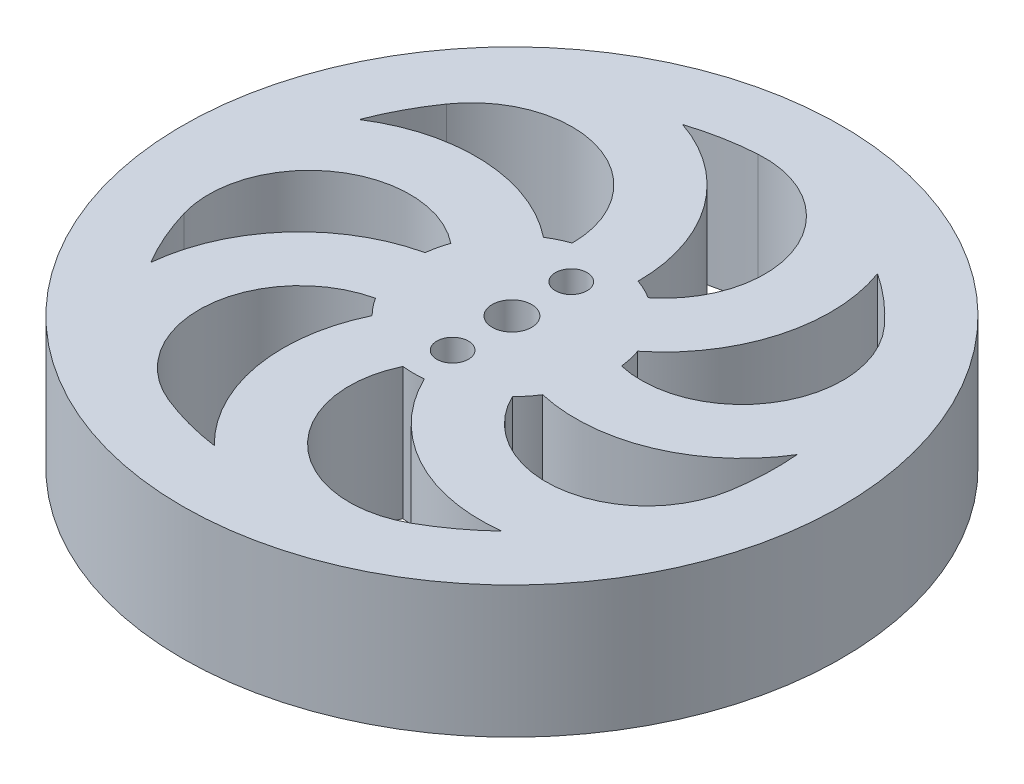
ISO-10303-21;
HEADER;
FILE_DESCRIPTION(('STEP AP214'),'2;1');
FILE_NAME('part.step','',(''),(''),'','','');
FILE_SCHEMA(('AUTOMOTIVE_DESIGN { 1 0 10303 214 1 1 1 1 }'));
ENDSEC;
DATA;
#1=APPLICATION_CONTEXT('core data for automotive mechanical design processes');
#2=APPLICATION_PROTOCOL_DEFINITION('international standard','automotive_design',2000,#1);
#3=PRODUCT_CONTEXT('',#1,'mechanical');
#4=PRODUCT('Part','Part','',(#3));
#5=PRODUCT_RELATED_PRODUCT_CATEGORY('part','',(#4));
#6=PRODUCT_DEFINITION_FORMATION('','',#4);
#7=PRODUCT_DEFINITION_CONTEXT('part definition',#1,'design');
#8=PRODUCT_DEFINITION('design','',#6,#7);
#9=PRODUCT_DEFINITION_SHAPE('','',#8);
#10=(LENGTH_UNIT() NAMED_UNIT(*) SI_UNIT(.MILLI.,.METRE.));
#11=(NAMED_UNIT(*) PLANE_ANGLE_UNIT() SI_UNIT($,.RADIAN.));
#12=(NAMED_UNIT(*) SI_UNIT($,.STERADIAN.) SOLID_ANGLE_UNIT());
#13=UNCERTAINTY_MEASURE_WITH_UNIT(LENGTH_MEASURE(1.E-05),#10,'distance_accuracy_value','');
#14=(GEOMETRIC_REPRESENTATION_CONTEXT(3) GLOBAL_UNCERTAINTY_ASSIGNED_CONTEXT((#13)) GLOBAL_UNIT_ASSIGNED_CONTEXT((#10,
#11,#12)) REPRESENTATION_CONTEXT('',''));
#15=CARTESIAN_POINT('',(0.,0.,0.));
#16=DIRECTION('',(0.,0.,1.));
#17=DIRECTION('',(1.,0.,0.));
#18=AXIS2_PLACEMENT_3D('',#15,#16,#17);
#19=CARTESIAN_POINT('',(0.,0.,0.));
#20=DIRECTION('',(0.,1.,0.));
#21=DIRECTION('',(0.,0.,1.));
#22=AXIS2_PLACEMENT_3D('',#19,#20,#21);
#23=PLANE('',#22);
#24=CARTESIAN_POINT('',(0.,0.,-4.5));
#25=DIRECTION('',(0.,-1.,0.));
#26=DIRECTION('',(0.,0.,-1.));
#27=AXIS2_PLACEMENT_3D('',#24,#25,#26);
#28=CIRCLE('',#27,1.19999999999999);
#29=CARTESIAN_POINT('',(0.,0.,-5.69999999999999));
#30=VERTEX_POINT('',#29);
#31=EDGE_CURVE('E451',#30,#30,#28,.T.);
#32=ORIENTED_EDGE('',*,*,#31,.F.);
#33=EDGE_LOOP('',(#32));
#34=FACE_BOUND('',#33,.T.);
#35=CARTESIAN_POINT('',(12.2028445857767,0.,1.97171293970917));
#36=DIRECTION('',(0.,1.,0.));
#37=DIRECTION('',(-0.433883739117553,0.,-0.900968867902422));
#38=AXIS2_PLACEMENT_3D('',#35,#36,#37);
#39=CIRCLE('',#38,7.63888888888887);
#40=CARTESIAN_POINT('',(5.32044351152205,0.,5.28610261352378));
#41=VERTEX_POINT('',#40);
#42=CARTESIAN_POINT('',(19.7439283185599,0.,3.19018722829348));
#43=VERTEX_POINT('',#42);
#44=EDGE_CURVE('E368',#41,#43,#39,.T.);
#45=ORIENTED_EDGE('',*,*,#44,.T.);
#46=CARTESIAN_POINT('',(0.,0.,0.));
#47=DIRECTION('',(0.,1.,0.));
#48=DIRECTION('',(0.,0.,1.));
#49=AXIS2_PLACEMENT_3D('',#46,#47,#48);
#50=CIRCLE('',#49,20.);
#51=CARTESIAN_POINT('',(19.9269028790839,0.,-1.70837397766344));
#52=VERTEX_POINT('',#51);
#53=EDGE_CURVE('E427',#43,#52,#50,.T.);
#54=ORIENTED_EDGE('',*,*,#53,.T.);
#55=CARTESIAN_POINT('',(9.149896403553,0.,-8.31122516272318));
#56=DIRECTION('',(0.,1.,0.));
#57=DIRECTION('',(-0.974927912181823,0.,-0.222520933956318));
#58=AXIS2_PLACEMENT_3D('',#55,#56,#57);
#59=CIRCLE('',#58,12.6388888888889);
#60=CARTESIAN_POINT('',(6.3374790438273,0.,4.01078039401933));
#61=VERTEX_POINT('',#60);
#62=EDGE_CURVE('E391',#61,#52,#59,.T.);
#63=ORIENTED_EDGE('',*,*,#62,.F.);
#64=CARTESIAN_POINT('',(0.,0.,0.));
#65=DIRECTION('',(0.,1.,0.));
#66=DIRECTION('',(0.,0.,1.));
#67=AXIS2_PLACEMENT_3D('',#64,#65,#66);
#68=CIRCLE('',#67,7.5);
#69=EDGE_CURVE('E537',#41,#61,#68,.T.);
#70=ORIENTED_EDGE('',*,*,#69,.F.);
#71=EDGE_LOOP('',(#45,#54,#63,#70));
#72=FACE_BOUND('',#71,.T.);
#73=CARTESIAN_POINT('',(9.149896403553,0.,-8.31122516272318));
#74=DIRECTION('',(0.,1.,0.));
#75=DIRECTION('',(-0.974927912181823,0.,-0.222520933956318));
#76=AXIS2_PLACEMENT_3D('',#73,#74,#75);
#77=CIRCLE('',#76,7.63888888888887);
#78=CARTESIAN_POINT('',(7.45008371360889,0.,-0.863859166889832));
#79=VERTEX_POINT('',#78);
#80=CARTESIAN_POINT('',(14.8043267652992,0.,-13.4473755441813));
#81=VERTEX_POINT('',#80);
#82=EDGE_CURVE('E387',#79,#81,#77,.T.);
#83=ORIENTED_EDGE('',*,*,#82,.T.);
#84=CARTESIAN_POINT('',(11.0885601681718,0.,-16.6446337717846));
#85=VERTEX_POINT('',#84);
#86=EDGE_CURVE('E423',#81,#85,#50,.T.);
#87=ORIENTED_EDGE('',*,*,#86,.T.);
#88=CARTESIAN_POINT('',(-0.793110394418279,0.,-12.3356411995283));
#89=DIRECTION('',(0.,1.,0.));
#90=DIRECTION('',(-0.781831482468031,0.,0.623489801858732));
#91=AXIS2_PLACEMENT_3D('',#88,#89,#90);
#92=CIRCLE('',#91,12.6388888888889);
#93=CARTESIAN_POINT('',(7.08710793462959,0.,-2.45415996277958));
#94=VERTEX_POINT('',#93);
#95=EDGE_CURVE('E410',#94,#85,#92,.T.);
#96=ORIENTED_EDGE('',*,*,#95,.F.);
#97=EDGE_CURVE('E536',#79,#94,#68,.T.);
#98=ORIENTED_EDGE('',*,*,#97,.F.);
#99=EDGE_LOOP('',(#83,#87,#96,#98));
#100=FACE_BOUND('',#99,.T.);
#101=CARTESIAN_POINT('',(-0.793110394418279,0.,-12.3356411995283));
#102=DIRECTION('',(0.,1.,0.));
#103=DIRECTION('',(-0.781831482468031,0.,0.623489801858732));
#104=AXIS2_PLACEMENT_3D('',#101,#102,#103);
#105=CIRCLE('',#104,7.63888888888887);
#106=CARTESIAN_POINT('',(3.9696589253359,0.,-6.36331737511976));
#107=VERTEX_POINT('',#106);
#108=CARTESIAN_POINT('',(-1.28323479546328,0.,-19.9587902554166));
#109=VERTEX_POINT('',#108);
#110=EDGE_CURVE('E406',#107,#109,#105,.T.);
#111=ORIENTED_EDGE('',*,*,#110,.T.);
#112=CARTESIAN_POINT('',(-6.09969451477977,0.,-19.0471448470989));
#113=VERTEX_POINT('',#112);
#114=EDGE_CURVE('E284',#109,#113,#50,.T.);
#115=ORIENTED_EDGE('',*,*,#114,.T.);
#116=CARTESIAN_POINT('',(-10.1388888888889,0.,-7.07106781186549));
#117=DIRECTION('',(0.,1.,0.));
#118=DIRECTION('',(0.,0.,1.));
#119=AXIS2_PLACEMENT_3D('',#116,#117,#118);
#120=CIRCLE('',#119,12.6388888888889);
#121=CARTESIAN_POINT('',(2.5,0.,-7.07106781186547));
#122=VERTEX_POINT('',#121);
#123=EDGE_CURVE('E290',#122,#113,#120,.T.);
#124=ORIENTED_EDGE('',*,*,#123,.F.);
#125=EDGE_CURVE('E287',#107,#122,#68,.T.);
#126=ORIENTED_EDGE('',*,*,#125,.F.);
#127=EDGE_LOOP('',(#111,#115,#124,#126));
#128=FACE_BOUND('',#127,.T.);
#129=CARTESIAN_POINT('',(-11.8498772543839,0.,3.51816386162883));
#130=DIRECTION('',(0.,1.,0.));
#131=DIRECTION('',(0.781831482468022,0.,0.623489801858743));
#132=AXIS2_PLACEMENT_3D('',#129,#130,#131);
#133=CIRCLE('',#132,7.63888888888887);
#134=CARTESIAN_POINT('',(-7.08710793462957,0.,-2.45415996277965));
#135=VERTEX_POINT('',#134);
#136=CARTESIAN_POINT('',(-19.1728351082166,0.,5.69231006825337));
#137=VERTEX_POINT('',#136);
#138=EDGE_CURVE('E448',#135,#137,#133,.T.);
#139=ORIENTED_EDGE('',*,*,#138,.T.);
#140=CARTESIAN_POINT('',(-17.21228343853,0.,10.1851508988186));
#141=VERTEX_POINT('',#140);
#142=EDGE_CURVE('E244',#137,#141,#50,.T.);
#143=ORIENTED_EDGE('',*,*,#142,.T.);
#144=CARTESIAN_POINT('',(-4.63766635388336,0.,11.4581463898527));
#145=DIRECTION('',(0.,1.,0.));
#146=DIRECTION('',(0.974927912181826,0.,-0.222520933956305));
#147=AXIS2_PLACEMENT_3D('',#144,#145,#146);
#148=CIRCLE('',#147,12.6388888888889);
#149=CARTESIAN_POINT('',(-7.45008371360888,0.,-0.863859166889897));
#150=VERTEX_POINT('',#149);
#151=EDGE_CURVE('E335',#150,#141,#148,.T.);
#152=ORIENTED_EDGE('',*,*,#151,.F.);
#153=EDGE_CURVE('E291',#135,#150,#68,.T.);
#154=ORIENTED_EDGE('',*,*,#153,.F.);
#155=EDGE_LOOP('',(#139,#143,#152,#154));
#156=FACE_BOUND('',#155,.T.);
#157=CARTESIAN_POINT('',(-4.63766635388336,0.,11.4581463898527));
#158=DIRECTION('',(0.,1.,0.));
#159=DIRECTION('',(0.974927912181826,0.,-0.222520933956305));
#160=AXIS2_PLACEMENT_3D('',#157,#158,#159);
#161=CIRCLE('',#160,7.63888888888887);
#162=CARTESIAN_POINT('',(-6.33747904382733,0.,4.01078039401927));
#163=VERTEX_POINT('',#162);
#164=CARTESIAN_POINT('',(-7.50363994336183,0.,18.5390233723458));
#165=VERTEX_POINT('',#164);
#166=EDGE_CURVE('E245',#163,#165,#161,.T.);
#167=ORIENTED_EDGE('',*,*,#166,.T.);
#168=CARTESIAN_POINT('',(-2.76861156424142,0.,19.8074427932116));
#169=VERTEX_POINT('',#168);
#170=EDGE_CURVE('E437',#165,#169,#50,.T.);
#171=ORIENTED_EDGE('',*,*,#170,.T.);
#172=CARTESIAN_POINT('',(6.06680190224457,0.,10.7699109829263));
#173=DIRECTION('',(0.,1.,0.));
#174=DIRECTION('',(0.433883739117565,0.,-0.900968867902416));
#175=AXIS2_PLACEMENT_3D('',#172,#173,#174);
#176=CIRCLE('',#175,12.6388888888889);
#177=CARTESIAN_POINT('',(-5.3204435115221,0.,5.28610261352373));
#178=VERTEX_POINT('',#177);
#179=EDGE_CURVE('E353',#178,#169,#176,.T.);
#180=ORIENTED_EDGE('',*,*,#179,.F.);
#181=EDGE_CURVE('E541',#163,#178,#68,.T.);
#182=ORIENTED_EDGE('',*,*,#181,.F.);
#183=EDGE_LOOP('',(#167,#171,#180,#182));
#184=FACE_BOUND('',#183,.T.);
#185=CARTESIAN_POINT('',(6.06680190224457,0.,10.7699109829263));
#186=DIRECTION('',(0.,1.,0.));
#187=DIRECTION('',(0.433883739117565,0.,-0.900968867902416));
#188=AXIS2_PLACEMENT_3D('',#185,#186,#187);
#189=CIRCLE('',#188,7.63888888888887);
#190=CARTESIAN_POINT('',(-0.815599172009975,0.,7.45552130911157));
#191=VERTEX_POINT('',#190);
#192=CARTESIAN_POINT('',(9.81594914520467,0.,17.4254739499032));
#193=VERTEX_POINT('',#192);
#194=EDGE_CURVE('E349',#191,#193,#189,.T.);
#195=ORIENTED_EDGE('',*,*,#194,.T.);
#196=CARTESIAN_POINT('',(13.7598812873046,0.,14.5143262661167));
#197=VERTEX_POINT('',#196);
#198=EDGE_CURVE('E432',#193,#197,#50,.T.);
#199=ORIENTED_EDGE('',*,*,#198,.T.);
#200=CARTESIAN_POINT('',(12.2028445857767,0.,1.97171293970917));
#201=DIRECTION('',(0.,1.,0.));
#202=DIRECTION('',(-0.433883739117553,0.,-0.900968867902422));
#203=AXIS2_PLACEMENT_3D('',#200,#201,#202);
#204=CIRCLE('',#203,12.6388888888889);
#205=CARTESIAN_POINT('',(0.815599172009904,0.,7.45552130911157));
#206=VERTEX_POINT('',#205);
#207=EDGE_CURVE('E372',#206,#197,#204,.T.);
#208=ORIENTED_EDGE('',*,*,#207,.F.);
#209=EDGE_CURVE('E539',#191,#206,#68,.T.);
#210=ORIENTED_EDGE('',*,*,#209,.F.);
#211=EDGE_LOOP('',(#195,#199,#208,#210));
#212=FACE_BOUND('',#211,.T.);
#213=CARTESIAN_POINT('',(-16.4044943820225,0.,-11.4408288191981));
#214=VERTEX_POINT('',#213);
#215=CARTESIAN_POINT('',(-18.6947548170094,0.,-7.10676736160013));
#216=VERTEX_POINT('',#215);
#217=EDGE_CURVE('E280',#214,#216,#50,.T.);
#218=ORIENTED_EDGE('',*,*,#217,.T.);
#219=CARTESIAN_POINT('',(-11.8498772543839,0.,3.51816386162883));
#220=DIRECTION('',(0.,1.,0.));
#221=DIRECTION('',(0.781831482468022,0.,0.623489801858743));
#222=AXIS2_PLACEMENT_3D('',#219,#220,#221);
#223=CIRCLE('',#222,12.6388888888889);
#224=CARTESIAN_POINT('',(-3.96965892533584,0.,-6.3633173751198));
#225=VERTEX_POINT('',#224);
#226=EDGE_CURVE('E236',#225,#216,#223,.T.);
#227=ORIENTED_EDGE('',*,*,#226,.F.);
#228=CARTESIAN_POINT('',(-2.50000000000004,0.,-7.07106781186546));
#229=VERTEX_POINT('',#228);
#230=EDGE_CURVE('E288',#229,#225,#68,.T.);
#231=ORIENTED_EDGE('',*,*,#230,.F.);
#232=CARTESIAN_POINT('',(-10.1388888888889,0.,-7.07106781186549));
#233=DIRECTION('',(0.,1.,0.));
#234=DIRECTION('',(0.,0.,1.));
#235=AXIS2_PLACEMENT_3D('',#232,#233,#234);
#236=CIRCLE('',#235,7.63888888888887);
#237=EDGE_CURVE('E283',#229,#214,#236,.T.);
#238=ORIENTED_EDGE('',*,*,#237,.T.);
#239=EDGE_LOOP('',(#218,#227,#231,#238));
#240=FACE_BOUND('',#239,.T.);
#241=CARTESIAN_POINT('',(0.,0.,0.));
#242=DIRECTION('',(0.,1.,0.));
#243=DIRECTION('',(0.,0.,1.));
#244=AXIS2_PLACEMENT_3D('',#241,#242,#243);
#245=CIRCLE('',#244,25.);
#246=CARTESIAN_POINT('',(0.,0.,25.));
#247=VERTEX_POINT('',#246);
#248=EDGE_CURVE('E294',#247,#247,#245,.T.);
#249=ORIENTED_EDGE('',*,*,#248,.F.);
#250=EDGE_LOOP('',(#249));
#251=FACE_BOUND('',#250,.T.);
#252=CARTESIAN_POINT('',(0.,0.,0.));
#253=DIRECTION('',(0.,1.,0.));
#254=DIRECTION('',(0.,0.,1.));
#255=AXIS2_PLACEMENT_3D('',#252,#253,#254);
#256=CIRCLE('',#255,1.5);
#257=CARTESIAN_POINT('',(0.,0.,1.5));
#258=VERTEX_POINT('',#257);
#259=EDGE_CURVE('E297',#258,#258,#256,.T.);
#260=ORIENTED_EDGE('',*,*,#259,.T.);
#261=EDGE_LOOP('',(#260));
#262=FACE_BOUND('',#261,.T.);
#263=CARTESIAN_POINT('',(0.,0.,4.5));
#264=DIRECTION('',(0.,-1.,0.));
#265=DIRECTION('',(0.,0.,-1.));
#266=AXIS2_PLACEMENT_3D('',#263,#264,#265);
#267=CIRCLE('',#266,1.19999999999999);
#268=CARTESIAN_POINT('',(0.,0.,3.30000000000001));
#269=VERTEX_POINT('',#268);
#270=EDGE_CURVE('E459',#269,#269,#267,.T.);
#271=ORIENTED_EDGE('',*,*,#270,.F.);
#272=EDGE_LOOP('',(#271));
#273=FACE_BOUND('',#272,.T.);
#274=ADVANCED_FACE('F39',(#34,#72,#100,#128,#156,#184,#212,#240,#251,#262,#273),#23,.F.);
#275=CARTESIAN_POINT('',(0.,10.,0.));
#276=DIRECTION('',(0.,-1.,0.));
#277=DIRECTION('',(0.,0.,-1.));
#278=AXIS2_PLACEMENT_3D('',#275,#276,#277);
#279=CYLINDRICAL_SURFACE('',#278,20.);
#280=CARTESIAN_POINT('',(0.,10.,0.));
#281=DIRECTION('',(0.,1.,0.));
#282=DIRECTION('',(0.,0.,1.));
#283=AXIS2_PLACEMENT_3D('',#280,#281,#282);
#284=CIRCLE('',#283,20.);
#285=CARTESIAN_POINT('',(14.8043267652992,10.,-13.4473755441813));
#286=VERTEX_POINT('',#285);
#287=CARTESIAN_POINT('',(11.0885601681718,10.,-16.6446337717846));
#288=VERTEX_POINT('',#287);
#289=EDGE_CURVE('E526',#286,#288,#284,.T.);
#290=ORIENTED_EDGE('',*,*,#289,.T.);
#291=DIRECTION('',(0.,-1.,0.));
#292=VECTOR('',#291,1.);
#293=CARTESIAN_POINT('',(11.0885601681718,10.,-16.6446337717846));
#294=LINE('',#293,#292);
#295=EDGE_CURVE('E412',#288,#85,#294,.T.);
#296=ORIENTED_EDGE('',*,*,#295,.T.);
#297=ORIENTED_EDGE('',*,*,#86,.F.);
#298=DIRECTION('',(0.,-1.,0.));
#299=VECTOR('',#298,1.);
#300=CARTESIAN_POINT('',(14.8043267652992,10.,-13.4473755441813));
#301=LINE('',#300,#299);
#302=EDGE_CURVE('E403',#286,#81,#301,.T.);
#303=ORIENTED_EDGE('',*,*,#302,.F.);
#304=EDGE_LOOP('',(#290,#296,#297,#303));
#305=FACE_BOUND('',#304,.T.);
#306=ADVANCED_FACE('F466',(#305),#279,.F.);
#307=CARTESIAN_POINT('',(9.81594914520467,10.,17.4254739499032));
#308=VERTEX_POINT('',#307);
#309=CARTESIAN_POINT('',(13.7598812873046,10.,14.5143262661167));
#310=VERTEX_POINT('',#309);
#311=EDGE_CURVE('E259',#308,#310,#284,.T.);
#312=ORIENTED_EDGE('',*,*,#311,.T.);
#313=DIRECTION('',(0.,-1.,0.));
#314=VECTOR('',#313,1.);
#315=CARTESIAN_POINT('',(13.7598812873046,10.,14.5143262661167));
#316=LINE('',#315,#314);
#317=EDGE_CURVE('E374',#310,#197,#316,.T.);
#318=ORIENTED_EDGE('',*,*,#317,.T.);
#319=ORIENTED_EDGE('',*,*,#198,.F.);
#320=DIRECTION('',(0.,-1.,0.));
#321=VECTOR('',#320,1.);
#322=CARTESIAN_POINT('',(9.81594914520467,10.,17.4254739499032));
#323=LINE('',#322,#321);
#324=EDGE_CURVE('E365',#308,#193,#323,.T.);
#325=ORIENTED_EDGE('',*,*,#324,.F.);
#326=EDGE_LOOP('',(#312,#318,#319,#325));
#327=FACE_BOUND('',#326,.T.);
#328=ADVANCED_FACE('F472',(#327),#279,.F.);
#329=CARTESIAN_POINT('',(-19.1728351082166,10.,5.69231006825338));
#330=VERTEX_POINT('',#329);
#331=CARTESIAN_POINT('',(-17.21228343853,10.,10.1851508988186));
#332=VERTEX_POINT('',#331);
#333=EDGE_CURVE('E242',#330,#332,#284,.T.);
#334=ORIENTED_EDGE('',*,*,#333,.T.);
#335=DIRECTION('',(0.,-1.,0.));
#336=VECTOR('',#335,1.);
#337=CARTESIAN_POINT('',(-17.21228343853,10.,10.1851508988186));
#338=LINE('',#337,#336);
#339=EDGE_CURVE('E337',#332,#141,#338,.T.);
#340=ORIENTED_EDGE('',*,*,#339,.T.);
#341=ORIENTED_EDGE('',*,*,#142,.F.);
#342=DIRECTION('',(0.,-1.,0.));
#343=VECTOR('',#342,1.);
#344=CARTESIAN_POINT('',(-19.1728351082166,10.,5.69231006825338));
#345=LINE('',#344,#343);
#346=EDGE_CURVE('E229',#330,#137,#345,.T.);
#347=ORIENTED_EDGE('',*,*,#346,.F.);
#348=EDGE_LOOP('',(#334,#340,#341,#347));
#349=FACE_BOUND('',#348,.T.);
#350=ADVANCED_FACE('F240',(#349),#279,.F.);
#351=CARTESIAN_POINT('',(-16.4044943820225,10.,-11.4408288191981));
#352=VERTEX_POINT('',#351);
#353=CARTESIAN_POINT('',(-18.6947548170094,10.,-7.10676736160013));
#354=VERTEX_POINT('',#353);
#355=EDGE_CURVE('E252',#352,#354,#284,.T.);
#356=ORIENTED_EDGE('',*,*,#355,.T.);
#357=DIRECTION('',(0.,-1.,0.));
#358=VECTOR('',#357,1.);
#359=CARTESIAN_POINT('',(-18.6947548170094,10.,-7.10676736160013));
#360=LINE('',#359,#358);
#361=EDGE_CURVE('E322',#354,#216,#360,.T.);
#362=ORIENTED_EDGE('',*,*,#361,.T.);
#363=ORIENTED_EDGE('',*,*,#217,.F.);
#364=DIRECTION('',(0.,-1.,0.));
#365=VECTOR('',#364,1.);
#366=CARTESIAN_POINT('',(-16.4044943820225,10.,-11.4408288191981));
#367=LINE('',#366,#365);
#368=EDGE_CURVE('E11',#352,#214,#367,.T.);
#369=ORIENTED_EDGE('',*,*,#368,.F.);
#370=EDGE_LOOP('',(#356,#362,#363,#369));
#371=FACE_BOUND('',#370,.T.);
#372=ADVANCED_FACE('F320',(#371),#279,.F.);
#373=DIRECTION('',(0.,-1.,0.));
#374=VECTOR('',#373,1.);
#375=CARTESIAN_POINT('',(-7.50363994336183,10.,18.5390233723458));
#376=LINE('',#375,#374);
#377=CARTESIAN_POINT('',(-7.50363994336183,10.,18.5390233723458));
#378=VERTEX_POINT('',#377);
#379=EDGE_CURVE('E346',#378,#165,#376,.T.);
#380=ORIENTED_EDGE('',*,*,#379,.F.);
#381=CARTESIAN_POINT('',(-2.76861156424142,10.,19.8074427932116));
#382=VERTEX_POINT('',#381);
#383=EDGE_CURVE('E253',#378,#382,#284,.T.);
#384=ORIENTED_EDGE('',*,*,#383,.T.);
#385=DIRECTION('',(0.,-1.,0.));
#386=VECTOR('',#385,1.);
#387=CARTESIAN_POINT('',(-2.76861156424142,10.,19.8074427932116));
#388=LINE('',#387,#386);
#389=EDGE_CURVE('E355',#382,#169,#388,.T.);
#390=ORIENTED_EDGE('',*,*,#389,.T.);
#391=ORIENTED_EDGE('',*,*,#170,.F.);
#392=EDGE_LOOP('',(#380,#384,#390,#391));
#393=FACE_BOUND('',#392,.T.);
#394=ADVANCED_FACE('F506',(#393),#279,.F.);
#395=DIRECTION('',(0.,-1.,0.));
#396=VECTOR('',#395,1.);
#397=CARTESIAN_POINT('',(19.7439283185599,10.,3.19018722829348));
#398=LINE('',#397,#396);
#399=CARTESIAN_POINT('',(19.7439283185599,10.,3.19018722829348));
#400=VERTEX_POINT('',#399);
#401=EDGE_CURVE('E384',#400,#43,#398,.T.);
#402=ORIENTED_EDGE('',*,*,#401,.F.);
#403=CARTESIAN_POINT('',(19.9269028790839,10.,-1.70837397766344));
#404=VERTEX_POINT('',#403);
#405=EDGE_CURVE('E517',#400,#404,#284,.T.);
#406=ORIENTED_EDGE('',*,*,#405,.T.);
#407=DIRECTION('',(0.,-1.,0.));
#408=VECTOR('',#407,1.);
#409=CARTESIAN_POINT('',(19.9269028790839,10.,-1.70837397766344));
#410=LINE('',#409,#408);
#411=EDGE_CURVE('E393',#404,#52,#410,.T.);
#412=ORIENTED_EDGE('',*,*,#411,.T.);
#413=ORIENTED_EDGE('',*,*,#53,.F.);
#414=EDGE_LOOP('',(#402,#406,#412,#413));
#415=FACE_BOUND('',#414,.T.);
#416=ADVANCED_FACE('F499',(#415),#279,.F.);
#417=CARTESIAN_POINT('',(0.,10.,0.));
#418=DIRECTION('',(0.,-1.,0.));
#419=DIRECTION('',(0.,0.,-1.));
#420=AXIS2_PLACEMENT_3D('',#417,#418,#419);
#421=CYLINDRICAL_SURFACE('',#420,7.5);
#422=DIRECTION('',(0.,-1.,0.));
#423=VECTOR('',#422,1.);
#424=CARTESIAN_POINT('',(7.08710793462959,10.,-2.45415996277958));
#425=LINE('',#424,#423);
#426=CARTESIAN_POINT('',(7.08710793462959,10.,-2.45415996277958));
#427=VERTEX_POINT('',#426);
#428=EDGE_CURVE('E62',#427,#94,#425,.T.);
#429=ORIENTED_EDGE('',*,*,#428,.F.);
#430=CARTESIAN_POINT('',(0.,10.,0.));
#431=DIRECTION('',(0.,1.,0.));
#432=DIRECTION('',(0.,0.,1.));
#433=AXIS2_PLACEMENT_3D('',#430,#431,#432);
#434=CIRCLE('',#433,7.5);
#435=CARTESIAN_POINT('',(7.45008371360889,10.,-0.863859166889832));
#436=VERTEX_POINT('',#435);
#437=EDGE_CURVE('E947',#436,#427,#434,.T.);
#438=ORIENTED_EDGE('',*,*,#437,.F.);
#439=DIRECTION('',(0.,-1.,0.));
#440=VECTOR('',#439,1.);
#441=CARTESIAN_POINT('',(7.45008371360889,10.,-0.863859166889832));
#442=LINE('',#441,#440);
#443=EDGE_CURVE('E401',#436,#79,#442,.T.);
#444=ORIENTED_EDGE('',*,*,#443,.T.);
#445=ORIENTED_EDGE('',*,*,#97,.T.);
#446=EDGE_LOOP('',(#429,#438,#444,#445));
#447=FACE_BOUND('',#446,.T.);
#448=ADVANCED_FACE('F492',(#447),#421,.T.);
#449=DIRECTION('',(0.,-1.,0.));
#450=VECTOR('',#449,1.);
#451=CARTESIAN_POINT('',(0.815599172009904,10.,7.45552130911157));
#452=LINE('',#451,#450);
#453=CARTESIAN_POINT('',(0.815599172009904,10.,7.45552130911157));
#454=VERTEX_POINT('',#453);
#455=EDGE_CURVE('E379',#454,#206,#452,.T.);
#456=ORIENTED_EDGE('',*,*,#455,.F.);
#457=CARTESIAN_POINT('',(-0.815599172009975,10.,7.45552130911157));
#458=VERTEX_POINT('',#457);
#459=EDGE_CURVE('E931',#458,#454,#434,.T.);
#460=ORIENTED_EDGE('',*,*,#459,.F.);
#461=DIRECTION('',(0.,-1.,0.));
#462=VECTOR('',#461,1.);
#463=CARTESIAN_POINT('',(-0.815599172009973,10.,7.45552130911157));
#464=LINE('',#463,#462);
#465=EDGE_CURVE('E363',#458,#191,#464,.T.);
#466=ORIENTED_EDGE('',*,*,#465,.T.);
#467=ORIENTED_EDGE('',*,*,#209,.T.);
#468=EDGE_LOOP('',(#456,#460,#466,#467));
#469=FACE_BOUND('',#468,.T.);
#470=ADVANCED_FACE('F512',(#469),#421,.T.);
#471=DIRECTION('',(0.,-1.,0.));
#472=VECTOR('',#471,1.);
#473=CARTESIAN_POINT('',(-7.45008371360888,10.,-0.863859166889897));
#474=LINE('',#473,#472);
#475=CARTESIAN_POINT('',(-7.45008371360888,10.,-0.863859166889897));
#476=VERTEX_POINT('',#475);
#477=EDGE_CURVE('E341',#476,#150,#474,.T.);
#478=ORIENTED_EDGE('',*,*,#477,.F.);
#479=CARTESIAN_POINT('',(-7.08710793462957,10.,-2.45415996277965));
#480=VERTEX_POINT('',#479);
#481=EDGE_CURVE('E270',#480,#476,#434,.T.);
#482=ORIENTED_EDGE('',*,*,#481,.F.);
#483=DIRECTION('',(0.,-1.,0.));
#484=VECTOR('',#483,1.);
#485=CARTESIAN_POINT('',(-7.08710793462957,10.,-2.45415996277965));
#486=LINE('',#485,#484);
#487=EDGE_CURVE('E231',#480,#135,#486,.T.);
#488=ORIENTED_EDGE('',*,*,#487,.T.);
#489=ORIENTED_EDGE('',*,*,#153,.T.);
#490=EDGE_LOOP('',(#478,#482,#488,#489));
#491=FACE_BOUND('',#490,.T.);
#492=ADVANCED_FACE('F547',(#491),#421,.T.);
#493=DIRECTION('',(0.,-1.,0.));
#494=VECTOR('',#493,1.);
#495=CARTESIAN_POINT('',(-3.96965892533584,10.,-6.3633173751198));
#496=LINE('',#495,#494);
#497=CARTESIAN_POINT('',(-3.96965892533584,10.,-6.3633173751198));
#498=VERTEX_POINT('',#497);
#499=EDGE_CURVE('E325',#498,#225,#496,.T.);
#500=ORIENTED_EDGE('',*,*,#499,.F.);
#501=CARTESIAN_POINT('',(-2.50000000000004,10.,-7.07106781186546));
#502=VERTEX_POINT('',#501);
#503=EDGE_CURVE('E266',#502,#498,#434,.T.);
#504=ORIENTED_EDGE('',*,*,#503,.F.);
#505=DIRECTION('',(0.,-1.,0.));
#506=VECTOR('',#505,1.);
#507=CARTESIAN_POINT('',(-2.50000000000004,10.,-7.07106781186546));
#508=LINE('',#507,#506);
#509=EDGE_CURVE('E47',#502,#229,#508,.T.);
#510=ORIENTED_EDGE('',*,*,#509,.T.);
#511=ORIENTED_EDGE('',*,*,#230,.T.);
#512=EDGE_LOOP('',(#500,#504,#510,#511));
#513=FACE_BOUND('',#512,.T.);
#514=ADVANCED_FACE('F307',(#513),#421,.T.);
#515=CARTESIAN_POINT('',(-6.33747904382733,10.,4.01078039401927));
#516=VERTEX_POINT('',#515);
#517=CARTESIAN_POINT('',(-5.3204435115221,10.,5.28610261352373));
#518=VERTEX_POINT('',#517);
#519=EDGE_CURVE('E927',#516,#518,#434,.T.);
#520=ORIENTED_EDGE('',*,*,#519,.F.);
#521=DIRECTION('',(0.,-1.,0.));
#522=VECTOR('',#521,1.);
#523=CARTESIAN_POINT('',(-6.33747904382733,10.,4.01078039401927));
#524=LINE('',#523,#522);
#525=EDGE_CURVE('E344',#516,#163,#524,.T.);
#526=ORIENTED_EDGE('',*,*,#525,.T.);
#527=ORIENTED_EDGE('',*,*,#181,.T.);
#528=DIRECTION('',(0.,-1.,0.));
#529=VECTOR('',#528,1.);
#530=CARTESIAN_POINT('',(-5.32044351152209,10.,5.28610261352373));
#531=LINE('',#530,#529);
#532=EDGE_CURVE('E360',#518,#178,#531,.T.);
#533=ORIENTED_EDGE('',*,*,#532,.F.);
#534=EDGE_LOOP('',(#520,#526,#527,#533));
#535=FACE_BOUND('',#534,.T.);
#536=ADVANCED_FACE('F503',(#535),#421,.T.);
#537=CARTESIAN_POINT('',(5.32044351152205,10.,5.28610261352378));
#538=VERTEX_POINT('',#537);
#539=CARTESIAN_POINT('',(6.3374790438273,10.,4.01078039401933));
#540=VERTEX_POINT('',#539);
#541=EDGE_CURVE('E946',#538,#540,#434,.T.);
#542=ORIENTED_EDGE('',*,*,#541,.F.);
#543=DIRECTION('',(0.,-1.,0.));
#544=VECTOR('',#543,1.);
#545=CARTESIAN_POINT('',(5.32044351152205,10.,5.28610261352378));
#546=LINE('',#545,#544);
#547=EDGE_CURVE('E382',#538,#41,#546,.T.);
#548=ORIENTED_EDGE('',*,*,#547,.T.);
#549=ORIENTED_EDGE('',*,*,#69,.T.);
#550=DIRECTION('',(0.,-1.,0.));
#551=VECTOR('',#550,1.);
#552=CARTESIAN_POINT('',(6.3374790438273,10.,4.01078039401933));
#553=LINE('',#552,#551);
#554=EDGE_CURVE('E398',#540,#61,#553,.T.);
#555=ORIENTED_EDGE('',*,*,#554,.F.);
#556=EDGE_LOOP('',(#542,#548,#549,#555));
#557=FACE_BOUND('',#556,.T.);
#558=ADVANCED_FACE('F493',(#557),#421,.T.);
#559=DIRECTION('',(0.,-1.,0.));
#560=VECTOR('',#559,1.);
#561=CARTESIAN_POINT('',(-1.28323479546328,10.,-19.9587902554166));
#562=LINE('',#561,#560);
#563=CARTESIAN_POINT('',(-1.28323479546328,10.,-19.9587902554166));
#564=VERTEX_POINT('',#563);
#565=EDGE_CURVE('E262',#564,#109,#562,.T.);
#566=ORIENTED_EDGE('',*,*,#565,.F.);
#567=CARTESIAN_POINT('',(-6.09969451477977,10.,-19.0471448470989));
#568=VERTEX_POINT('',#567);
#569=EDGE_CURVE('E257',#564,#568,#284,.T.);
#570=ORIENTED_EDGE('',*,*,#569,.T.);
#571=DIRECTION('',(0.,-1.,0.));
#572=VECTOR('',#571,1.);
#573=CARTESIAN_POINT('',(-6.09969451477977,10.,-19.0471448470989));
#574=LINE('',#573,#572);
#575=EDGE_CURVE('E279',#568,#113,#574,.T.);
#576=ORIENTED_EDGE('',*,*,#575,.T.);
#577=ORIENTED_EDGE('',*,*,#114,.F.);
#578=EDGE_LOOP('',(#566,#570,#576,#577));
#579=FACE_BOUND('',#578,.T.);
#580=ADVANCED_FACE('F41',(#579),#279,.F.);
#581=CARTESIAN_POINT('',(-10.1388888888889,10.,-7.07106781186549));
#582=DIRECTION('',(0.,-1.,0.));
#583=DIRECTION('',(0.,0.,-1.));
#584=AXIS2_PLACEMENT_3D('',#581,#582,#583);
#585=CYLINDRICAL_SURFACE('',#584,7.63888888888887);
#586=ORIENTED_EDGE('',*,*,#237,.F.);
#587=ORIENTED_EDGE('',*,*,#509,.F.);
#588=CARTESIAN_POINT('',(-10.1388888888889,10.,-7.07106781186549));
#589=DIRECTION('',(0.,1.,0.));
#590=DIRECTION('',(0.,0.,1.));
#591=AXIS2_PLACEMENT_3D('',#588,#589,#590);
#592=CIRCLE('',#591,7.63888888888887);
#593=EDGE_CURVE('E256',#502,#352,#592,.T.);
#594=ORIENTED_EDGE('',*,*,#593,.T.);
#595=ORIENTED_EDGE('',*,*,#368,.T.);
#596=EDGE_LOOP('',(#586,#587,#594,#595));
#597=FACE_BOUND('',#596,.T.);
#598=ADVANCED_FACE('F315',(#597),#585,.F.);
#599=CARTESIAN_POINT('',(3.9696589253359,10.,-6.36331737511976));
#600=VERTEX_POINT('',#599);
#601=CARTESIAN_POINT('',(2.5,10.,-7.07106781186547));
#602=VERTEX_POINT('',#601);
#603=EDGE_CURVE('E54',#600,#602,#434,.T.);
#604=ORIENTED_EDGE('',*,*,#603,.F.);
#605=DIRECTION('',(0.,-1.,0.));
#606=VECTOR('',#605,1.);
#607=CARTESIAN_POINT('',(3.9696589253359,10.,-6.36331737511976));
#608=LINE('',#607,#606);
#609=EDGE_CURVE('E417',#600,#107,#608,.T.);
#610=ORIENTED_EDGE('',*,*,#609,.T.);
#611=ORIENTED_EDGE('',*,*,#125,.T.);
#612=DIRECTION('',(0.,-1.,0.));
#613=VECTOR('',#612,1.);
#614=CARTESIAN_POINT('',(2.5,10.,-7.07106781186547));
#615=LINE('',#614,#613);
#616=EDGE_CURVE('E302',#602,#122,#615,.T.);
#617=ORIENTED_EDGE('',*,*,#616,.F.);
#618=EDGE_LOOP('',(#604,#610,#611,#617));
#619=FACE_BOUND('',#618,.T.);
#620=ADVANCED_FACE('F486',(#619),#421,.T.);
#621=CARTESIAN_POINT('',(0.,10.,0.));
#622=DIRECTION('',(0.,-1.,0.));
#623=DIRECTION('',(0.,0.,-1.));
#624=AXIS2_PLACEMENT_3D('',#621,#622,#623);
#625=CYLINDRICAL_SURFACE('',#624,25.);
#626=CARTESIAN_POINT('',(0.,10.,0.));
#627=DIRECTION('',(0.,1.,0.));
#628=DIRECTION('',(0.,0.,1.));
#629=AXIS2_PLACEMENT_3D('',#626,#627,#628);
#630=CIRCLE('',#629,25.);
#631=CARTESIAN_POINT('',(0.,10.,25.));
#632=VERTEX_POINT('',#631);
#633=EDGE_CURVE('E273',#632,#632,#630,.T.);
#634=ORIENTED_EDGE('',*,*,#633,.F.);
#635=EDGE_LOOP('',(#634));
#636=FACE_BOUND('',#635,.T.);
#637=ORIENTED_EDGE('',*,*,#248,.T.);
#638=EDGE_LOOP('',(#637));
#639=FACE_BOUND('',#638,.T.);
#640=ADVANCED_FACE('F483',(#636,#639),#625,.T.);
#641=CARTESIAN_POINT('',(-10.1388888888889,10.,-7.07106781186549));
#642=DIRECTION('',(0.,-1.,0.));
#643=DIRECTION('',(0.,0.,-1.));
#644=AXIS2_PLACEMENT_3D('',#641,#642,#643);
#645=CYLINDRICAL_SURFACE('',#644,12.6388888888889);
#646=ORIENTED_EDGE('',*,*,#123,.T.);
#647=ORIENTED_EDGE('',*,*,#575,.F.);
#648=CARTESIAN_POINT('',(-10.1388888888889,10.,-7.07106781186549));
#649=DIRECTION('',(0.,1.,0.));
#650=DIRECTION('',(0.,0.,1.));
#651=AXIS2_PLACEMENT_3D('',#648,#649,#650);
#652=CIRCLE('',#651,12.6388888888889);
#653=EDGE_CURVE('E269',#602,#568,#652,.T.);
#654=ORIENTED_EDGE('',*,*,#653,.F.);
#655=ORIENTED_EDGE('',*,*,#616,.T.);
#656=EDGE_LOOP('',(#646,#647,#654,#655));
#657=FACE_BOUND('',#656,.T.);
#658=ADVANCED_FACE('F481',(#657),#645,.T.);
#659=CARTESIAN_POINT('',(0.,10.,0.));
#660=DIRECTION('',(0.,-1.,0.));
#661=DIRECTION('',(0.,0.,-1.));
#662=AXIS2_PLACEMENT_3D('',#659,#660,#661);
#663=CYLINDRICAL_SURFACE('',#662,1.5);
#664=CARTESIAN_POINT('',(0.,10.,0.));
#665=DIRECTION('',(0.,1.,0.));
#666=DIRECTION('',(0.,0.,1.));
#667=AXIS2_PLACEMENT_3D('',#664,#665,#666);
#668=CIRCLE('',#667,1.5);
#669=CARTESIAN_POINT('',(0.,10.,1.5));
#670=VERTEX_POINT('',#669);
#671=EDGE_CURVE('E276',#670,#670,#668,.T.);
#672=ORIENTED_EDGE('',*,*,#671,.T.);
#673=EDGE_LOOP('',(#672));
#674=FACE_BOUND('',#673,.T.);
#675=ORIENTED_EDGE('',*,*,#259,.F.);
#676=EDGE_LOOP('',(#675));
#677=FACE_BOUND('',#676,.T.);
#678=ADVANCED_FACE('F478',(#674,#677),#663,.F.);
#679=CARTESIAN_POINT('',(0.,10.,0.));
#680=DIRECTION('',(0.,1.,0.));
#681=DIRECTION('',(0.,0.,1.));
#682=AXIS2_PLACEMENT_3D('',#679,#680,#681);
#683=PLANE('',#682);
#684=CARTESIAN_POINT('',(0.,10.,4.5));
#685=DIRECTION('',(0.,-1.,0.));
#686=DIRECTION('',(0.,0.,-1.));
#687=AXIS2_PLACEMENT_3D('',#684,#685,#686);
#688=CIRCLE('',#687,1.2);
#689=CARTESIAN_POINT('',(0.,10.,3.3));
#690=VERTEX_POINT('',#689);
#691=EDGE_CURVE('E456',#690,#690,#688,.T.);
#692=ORIENTED_EDGE('',*,*,#691,.T.);
#693=EDGE_LOOP('',(#692));
#694=FACE_BOUND('',#693,.T.);
#695=CARTESIAN_POINT('',(0.,10.,-4.5));
#696=DIRECTION('',(0.,-1.,0.));
#697=DIRECTION('',(0.,0.,-1.));
#698=AXIS2_PLACEMENT_3D('',#695,#696,#697);
#699=CIRCLE('',#698,1.2);
#700=CARTESIAN_POINT('',(0.,10.,-5.7));
#701=VERTEX_POINT('',#700);
#702=EDGE_CURVE('E449',#701,#701,#699,.T.);
#703=ORIENTED_EDGE('',*,*,#702,.T.);
#704=EDGE_LOOP('',(#703));
#705=FACE_BOUND('',#704,.T.);
#706=ORIENTED_EDGE('',*,*,#405,.F.);
#707=CARTESIAN_POINT('',(12.2028445857767,10.,1.97171293970917));
#708=DIRECTION('',(0.,1.,0.));
#709=DIRECTION('',(-0.433883739117553,0.,-0.900968867902422));
#710=AXIS2_PLACEMENT_3D('',#707,#708,#709);
#711=CIRCLE('',#710,7.63888888888887);
#712=EDGE_CURVE('E369',#538,#400,#711,.T.);
#713=ORIENTED_EDGE('',*,*,#712,.F.);
#714=ORIENTED_EDGE('',*,*,#541,.T.);
#715=CARTESIAN_POINT('',(9.149896403553,10.,-8.31122516272318));
#716=DIRECTION('',(0.,1.,0.));
#717=DIRECTION('',(-0.974927912181823,0.,-0.222520933956318));
#718=AXIS2_PLACEMENT_3D('',#715,#716,#717);
#719=CIRCLE('',#718,12.6388888888889);
#720=EDGE_CURVE('E390',#540,#404,#719,.T.);
#721=ORIENTED_EDGE('',*,*,#720,.T.);
#722=EDGE_LOOP('',(#706,#713,#714,#721));
#723=FACE_BOUND('',#722,.T.);
#724=ORIENTED_EDGE('',*,*,#289,.F.);
#725=CARTESIAN_POINT('',(9.149896403553,10.,-8.31122516272318));
#726=DIRECTION('',(0.,1.,0.));
#727=DIRECTION('',(-0.974927912181823,0.,-0.222520933956318));
#728=AXIS2_PLACEMENT_3D('',#725,#726,#727);
#729=CIRCLE('',#728,7.63888888888887);
#730=EDGE_CURVE('E388',#436,#286,#729,.T.);
#731=ORIENTED_EDGE('',*,*,#730,.F.);
#732=ORIENTED_EDGE('',*,*,#437,.T.);
#733=CARTESIAN_POINT('',(-0.793110394418279,10.,-12.3356411995283));
#734=DIRECTION('',(0.,1.,0.));
#735=DIRECTION('',(-0.781831482468031,0.,0.623489801858732));
#736=AXIS2_PLACEMENT_3D('',#733,#734,#735);
#737=CIRCLE('',#736,12.6388888888889);
#738=EDGE_CURVE('E409',#427,#288,#737,.T.);
#739=ORIENTED_EDGE('',*,*,#738,.T.);
#740=EDGE_LOOP('',(#724,#731,#732,#739));
#741=FACE_BOUND('',#740,.T.);
#742=ORIENTED_EDGE('',*,*,#569,.F.);
#743=CARTESIAN_POINT('',(-0.793110394418279,10.,-12.3356411995283));
#744=DIRECTION('',(0.,1.,0.));
#745=DIRECTION('',(-0.781831482468031,0.,0.623489801858732));
#746=AXIS2_PLACEMENT_3D('',#743,#744,#745);
#747=CIRCLE('',#746,7.63888888888887);
#748=EDGE_CURVE('E407',#600,#564,#747,.T.);
#749=ORIENTED_EDGE('',*,*,#748,.F.);
#750=ORIENTED_EDGE('',*,*,#603,.T.);
#751=ORIENTED_EDGE('',*,*,#653,.T.);
#752=EDGE_LOOP('',(#742,#749,#750,#751));
#753=FACE_BOUND('',#752,.T.);
#754=ORIENTED_EDGE('',*,*,#333,.F.);
#755=CARTESIAN_POINT('',(-11.8498772543839,10.,3.51816386162883));
#756=DIRECTION('',(0.,1.,0.));
#757=DIRECTION('',(0.781831482468022,0.,0.623489801858743));
#758=AXIS2_PLACEMENT_3D('',#755,#756,#757);
#759=CIRCLE('',#758,7.63888888888887);
#760=EDGE_CURVE('E225',#480,#330,#759,.T.);
#761=ORIENTED_EDGE('',*,*,#760,.F.);
#762=ORIENTED_EDGE('',*,*,#481,.T.);
#763=CARTESIAN_POINT('',(-4.63766635388336,10.,11.4581463898527));
#764=DIRECTION('',(0.,1.,0.));
#765=DIRECTION('',(0.974927912181826,0.,-0.222520933956305));
#766=AXIS2_PLACEMENT_3D('',#763,#764,#765);
#767=CIRCLE('',#766,12.6388888888889);
#768=EDGE_CURVE('E250',#476,#332,#767,.T.);
#769=ORIENTED_EDGE('',*,*,#768,.T.);
#770=EDGE_LOOP('',(#754,#761,#762,#769));
#771=FACE_BOUND('',#770,.T.);
#772=ORIENTED_EDGE('',*,*,#383,.F.);
#773=CARTESIAN_POINT('',(-4.63766635388336,10.,11.4581463898527));
#774=DIRECTION('',(0.,1.,0.));
#775=DIRECTION('',(0.974927912181826,0.,-0.222520933956305));
#776=AXIS2_PLACEMENT_3D('',#773,#774,#775);
#777=CIRCLE('',#776,7.63888888888887);
#778=EDGE_CURVE('E333',#516,#378,#777,.T.);
#779=ORIENTED_EDGE('',*,*,#778,.F.);
#780=ORIENTED_EDGE('',*,*,#519,.T.);
#781=CARTESIAN_POINT('',(6.06680190224457,10.,10.7699109829263));
#782=DIRECTION('',(0.,1.,0.));
#783=DIRECTION('',(0.433883739117565,0.,-0.900968867902416));
#784=AXIS2_PLACEMENT_3D('',#781,#782,#783);
#785=CIRCLE('',#784,12.6388888888889);
#786=EDGE_CURVE('E352',#518,#382,#785,.T.);
#787=ORIENTED_EDGE('',*,*,#786,.T.);
#788=EDGE_LOOP('',(#772,#779,#780,#787));
#789=FACE_BOUND('',#788,.T.);
#790=ORIENTED_EDGE('',*,*,#311,.F.);
#791=CARTESIAN_POINT('',(6.06680190224457,10.,10.7699109829263));
#792=DIRECTION('',(0.,1.,0.));
#793=DIRECTION('',(0.433883739117565,0.,-0.900968867902416));
#794=AXIS2_PLACEMENT_3D('',#791,#792,#793);
#795=CIRCLE('',#794,7.63888888888887);
#796=EDGE_CURVE('E350',#458,#308,#795,.T.);
#797=ORIENTED_EDGE('',*,*,#796,.F.);
#798=ORIENTED_EDGE('',*,*,#459,.T.);
#799=CARTESIAN_POINT('',(12.2028445857767,10.,1.97171293970917));
#800=DIRECTION('',(0.,1.,0.));
#801=DIRECTION('',(-0.433883739117553,0.,-0.900968867902422));
#802=AXIS2_PLACEMENT_3D('',#799,#800,#801);
#803=CIRCLE('',#802,12.6388888888889);
#804=EDGE_CURVE('E371',#454,#310,#803,.T.);
#805=ORIENTED_EDGE('',*,*,#804,.T.);
#806=EDGE_LOOP('',(#790,#797,#798,#805));
#807=FACE_BOUND('',#806,.T.);
#808=ORIENTED_EDGE('',*,*,#355,.F.);
#809=ORIENTED_EDGE('',*,*,#593,.F.);
#810=ORIENTED_EDGE('',*,*,#503,.T.);
#811=CARTESIAN_POINT('',(-11.8498772543839,10.,3.51816386162883));
#812=DIRECTION('',(0.,1.,0.));
#813=DIRECTION('',(0.781831482468022,0.,0.623489801858743));
#814=AXIS2_PLACEMENT_3D('',#811,#812,#813);
#815=CIRCLE('',#814,12.6388888888889);
#816=EDGE_CURVE('E235',#498,#354,#815,.T.);
#817=ORIENTED_EDGE('',*,*,#816,.T.);
#818=EDGE_LOOP('',(#808,#809,#810,#817));
#819=FACE_BOUND('',#818,.T.);
#820=ORIENTED_EDGE('',*,*,#633,.T.);
#821=EDGE_LOOP('',(#820));
#822=FACE_BOUND('',#821,.T.);
#823=ORIENTED_EDGE('',*,*,#671,.F.);
#824=EDGE_LOOP('',(#823));
#825=FACE_BOUND('',#824,.T.);
#826=ADVANCED_FACE('F247',(#694,#705,#723,#741,#753,#771,#789,#807,#819,#822,#825),#683,.T.);
#827=CARTESIAN_POINT('',(9.149896403553,10.,-8.31122516272318));
#828=DIRECTION('',(0.,-1.,0.));
#829=DIRECTION('',(0.,0.,-1.));
#830=AXIS2_PLACEMENT_3D('',#827,#828,#829);
#831=CYLINDRICAL_SURFACE('',#830,7.63888888888887);
#832=ORIENTED_EDGE('',*,*,#82,.F.);
#833=ORIENTED_EDGE('',*,*,#443,.F.);
#834=ORIENTED_EDGE('',*,*,#730,.T.);
#835=ORIENTED_EDGE('',*,*,#302,.T.);
#836=EDGE_LOOP('',(#832,#833,#834,#835));
#837=FACE_BOUND('',#836,.T.);
#838=ADVANCED_FACE('F581',(#837),#831,.F.);
#839=CARTESIAN_POINT('',(9.149896403553,10.,-8.31122516272318));
#840=DIRECTION('',(0.,-1.,0.));
#841=DIRECTION('',(0.,0.,-1.));
#842=AXIS2_PLACEMENT_3D('',#839,#840,#841);
#843=CYLINDRICAL_SURFACE('',#842,12.6388888888889);
#844=ORIENTED_EDGE('',*,*,#62,.T.);
#845=ORIENTED_EDGE('',*,*,#411,.F.);
#846=ORIENTED_EDGE('',*,*,#720,.F.);
#847=ORIENTED_EDGE('',*,*,#554,.T.);
#848=EDGE_LOOP('',(#844,#845,#846,#847));
#849=FACE_BOUND('',#848,.T.);
#850=ADVANCED_FACE('F573',(#849),#843,.T.);
#851=CARTESIAN_POINT('',(6.06680190224457,10.,10.7699109829263));
#852=DIRECTION('',(0.,-1.,0.));
#853=DIRECTION('',(0.,0.,-1.));
#854=AXIS2_PLACEMENT_3D('',#851,#852,#853);
#855=CYLINDRICAL_SURFACE('',#854,7.63888888888887);
#856=ORIENTED_EDGE('',*,*,#194,.F.);
#857=ORIENTED_EDGE('',*,*,#465,.F.);
#858=ORIENTED_EDGE('',*,*,#796,.T.);
#859=ORIENTED_EDGE('',*,*,#324,.T.);
#860=EDGE_LOOP('',(#856,#857,#858,#859));
#861=FACE_BOUND('',#860,.T.);
#862=ADVANCED_FACE('F569',(#861),#855,.F.);
#863=CARTESIAN_POINT('',(6.06680190224457,10.,10.7699109829263));
#864=DIRECTION('',(0.,-1.,0.));
#865=DIRECTION('',(0.,0.,-1.));
#866=AXIS2_PLACEMENT_3D('',#863,#864,#865);
#867=CYLINDRICAL_SURFACE('',#866,12.6388888888889);
#868=ORIENTED_EDGE('',*,*,#179,.T.);
#869=ORIENTED_EDGE('',*,*,#389,.F.);
#870=ORIENTED_EDGE('',*,*,#786,.F.);
#871=ORIENTED_EDGE('',*,*,#532,.T.);
#872=EDGE_LOOP('',(#868,#869,#870,#871));
#873=FACE_BOUND('',#872,.T.);
#874=ADVANCED_FACE('F566',(#873),#867,.T.);
#875=CARTESIAN_POINT('',(-11.8498772543839,10.,3.51816386162883));
#876=DIRECTION('',(0.,-1.,0.));
#877=DIRECTION('',(0.,0.,-1.));
#878=AXIS2_PLACEMENT_3D('',#875,#876,#877);
#879=CYLINDRICAL_SURFACE('',#878,7.63888888888887);
#880=ORIENTED_EDGE('',*,*,#138,.F.);
#881=ORIENTED_EDGE('',*,*,#487,.F.);
#882=ORIENTED_EDGE('',*,*,#760,.T.);
#883=ORIENTED_EDGE('',*,*,#346,.T.);
#884=EDGE_LOOP('',(#880,#881,#882,#883));
#885=FACE_BOUND('',#884,.T.);
#886=ADVANCED_FACE('F228',(#885),#879,.F.);
#887=CARTESIAN_POINT('',(-11.8498772543839,10.,3.51816386162883));
#888=DIRECTION('',(0.,-1.,0.));
#889=DIRECTION('',(0.,0.,-1.));
#890=AXIS2_PLACEMENT_3D('',#887,#888,#889);
#891=CYLINDRICAL_SURFACE('',#890,12.6388888888889);
#892=ORIENTED_EDGE('',*,*,#226,.T.);
#893=ORIENTED_EDGE('',*,*,#361,.F.);
#894=ORIENTED_EDGE('',*,*,#816,.F.);
#895=ORIENTED_EDGE('',*,*,#499,.T.);
#896=EDGE_LOOP('',(#892,#893,#894,#895));
#897=FACE_BOUND('',#896,.T.);
#898=ADVANCED_FACE('F560',(#897),#891,.T.);
#899=CARTESIAN_POINT('',(-4.63766635388336,10.,11.4581463898527));
#900=DIRECTION('',(0.,-1.,0.));
#901=DIRECTION('',(0.,0.,-1.));
#902=AXIS2_PLACEMENT_3D('',#899,#900,#901);
#903=CYLINDRICAL_SURFACE('',#902,7.63888888888887);
#904=ORIENTED_EDGE('',*,*,#166,.F.);
#905=ORIENTED_EDGE('',*,*,#525,.F.);
#906=ORIENTED_EDGE('',*,*,#778,.T.);
#907=ORIENTED_EDGE('',*,*,#379,.T.);
#908=EDGE_LOOP('',(#904,#905,#906,#907));
#909=FACE_BOUND('',#908,.T.);
#910=ADVANCED_FACE('F552',(#909),#903,.F.);
#911=CARTESIAN_POINT('',(-4.63766635388336,10.,11.4581463898527));
#912=DIRECTION('',(0.,-1.,0.));
#913=DIRECTION('',(0.,0.,-1.));
#914=AXIS2_PLACEMENT_3D('',#911,#912,#913);
#915=CYLINDRICAL_SURFACE('',#914,12.6388888888889);
#916=ORIENTED_EDGE('',*,*,#151,.T.);
#917=ORIENTED_EDGE('',*,*,#339,.F.);
#918=ORIENTED_EDGE('',*,*,#768,.F.);
#919=ORIENTED_EDGE('',*,*,#477,.T.);
#920=EDGE_LOOP('',(#916,#917,#918,#919));
#921=FACE_BOUND('',#920,.T.);
#922=ADVANCED_FACE('F549',(#921),#915,.T.);
#923=CARTESIAN_POINT('',(12.2028445857767,10.,1.97171293970917));
#924=DIRECTION('',(0.,-1.,0.));
#925=DIRECTION('',(0.,0.,-1.));
#926=AXIS2_PLACEMENT_3D('',#923,#924,#925);
#927=CYLINDRICAL_SURFACE('',#926,7.63888888888887);
#928=ORIENTED_EDGE('',*,*,#44,.F.);
#929=ORIENTED_EDGE('',*,*,#547,.F.);
#930=ORIENTED_EDGE('',*,*,#712,.T.);
#931=ORIENTED_EDGE('',*,*,#401,.T.);
#932=EDGE_LOOP('',(#928,#929,#930,#931));
#933=FACE_BOUND('',#932,.T.);
#934=ADVANCED_FACE('F551',(#933),#927,.F.);
#935=CARTESIAN_POINT('',(12.2028445857767,10.,1.97171293970917));
#936=DIRECTION('',(0.,-1.,0.));
#937=DIRECTION('',(0.,0.,-1.));
#938=AXIS2_PLACEMENT_3D('',#935,#936,#937);
#939=CYLINDRICAL_SURFACE('',#938,12.6388888888889);
#940=ORIENTED_EDGE('',*,*,#207,.T.);
#941=ORIENTED_EDGE('',*,*,#317,.F.);
#942=ORIENTED_EDGE('',*,*,#804,.F.);
#943=ORIENTED_EDGE('',*,*,#455,.T.);
#944=EDGE_LOOP('',(#940,#941,#942,#943));
#945=FACE_BOUND('',#944,.T.);
#946=ADVANCED_FACE('F558',(#945),#939,.T.);
#947=CARTESIAN_POINT('',(-0.793110394418279,10.,-12.3356411995283));
#948=DIRECTION('',(0.,-1.,0.));
#949=DIRECTION('',(0.,0.,-1.));
#950=AXIS2_PLACEMENT_3D('',#947,#948,#949);
#951=CYLINDRICAL_SURFACE('',#950,7.63888888888887);
#952=ORIENTED_EDGE('',*,*,#110,.F.);
#953=ORIENTED_EDGE('',*,*,#609,.F.);
#954=ORIENTED_EDGE('',*,*,#748,.T.);
#955=ORIENTED_EDGE('',*,*,#565,.T.);
#956=EDGE_LOOP('',(#952,#953,#954,#955));
#957=FACE_BOUND('',#956,.T.);
#958=ADVANCED_FACE('F576',(#957),#951,.F.);
#959=CARTESIAN_POINT('',(-0.793110394418279,10.,-12.3356411995283));
#960=DIRECTION('',(0.,-1.,0.));
#961=DIRECTION('',(0.,0.,-1.));
#962=AXIS2_PLACEMENT_3D('',#959,#960,#961);
#963=CYLINDRICAL_SURFACE('',#962,12.6388888888889);
#964=ORIENTED_EDGE('',*,*,#95,.T.);
#965=ORIENTED_EDGE('',*,*,#295,.F.);
#966=ORIENTED_EDGE('',*,*,#738,.F.);
#967=ORIENTED_EDGE('',*,*,#428,.T.);
#968=EDGE_LOOP('',(#964,#965,#966,#967));
#969=FACE_BOUND('',#968,.T.);
#970=ADVANCED_FACE('F586',(#969),#963,.T.);
#971=CARTESIAN_POINT('',(0.,0.,-4.5));
#972=DIRECTION('',(0.,-1.,0.));
#973=DIRECTION('',(0.,0.,-1.));
#974=AXIS2_PLACEMENT_3D('',#971,#972,#973);
#975=CYLINDRICAL_SURFACE('',#974,1.19999999999999);
#976=ORIENTED_EDGE('',*,*,#702,.F.);
#977=EDGE_LOOP('',(#976));
#978=FACE_BOUND('',#977,.T.);
#979=ORIENTED_EDGE('',*,*,#31,.T.);
#980=EDGE_LOOP('',(#979));
#981=FACE_BOUND('',#980,.T.);
#982=ADVANCED_FACE('F588',(#978,#981),#975,.F.);
#983=CARTESIAN_POINT('',(0.,0.,4.5));
#984=DIRECTION('',(0.,-1.,0.));
#985=DIRECTION('',(0.,0.,-1.));
#986=AXIS2_PLACEMENT_3D('',#983,#984,#985);
#987=CYLINDRICAL_SURFACE('',#986,1.19999999999999);
#988=ORIENTED_EDGE('',*,*,#691,.F.);
#989=EDGE_LOOP('',(#988));
#990=FACE_BOUND('',#989,.T.);
#991=ORIENTED_EDGE('',*,*,#270,.T.);
#992=EDGE_LOOP('',(#991));
#993=FACE_BOUND('',#992,.T.);
#994=ADVANCED_FACE('F463',(#990,#993),#987,.F.);
#995=CLOSED_SHELL('',(#274,#306,#328,#350,#372,#394,#416,#448,#470,#492,#514,#536,#558,#580,
#598,#620,#640,#658,#678,#826,#838,#850,#862,#874,#886,#898,#910,#922,#934,#946,#958,#970,#982,#994));
#996=MANIFOLD_SOLID_BREP('B2',#995);
#997=ADVANCED_BREP_SHAPE_REPRESENTATION('',(#18,#996),#14);
#998=SHAPE_DEFINITION_REPRESENTATION(#9,#997);
ENDSEC;
END-ISO-10303-21;
